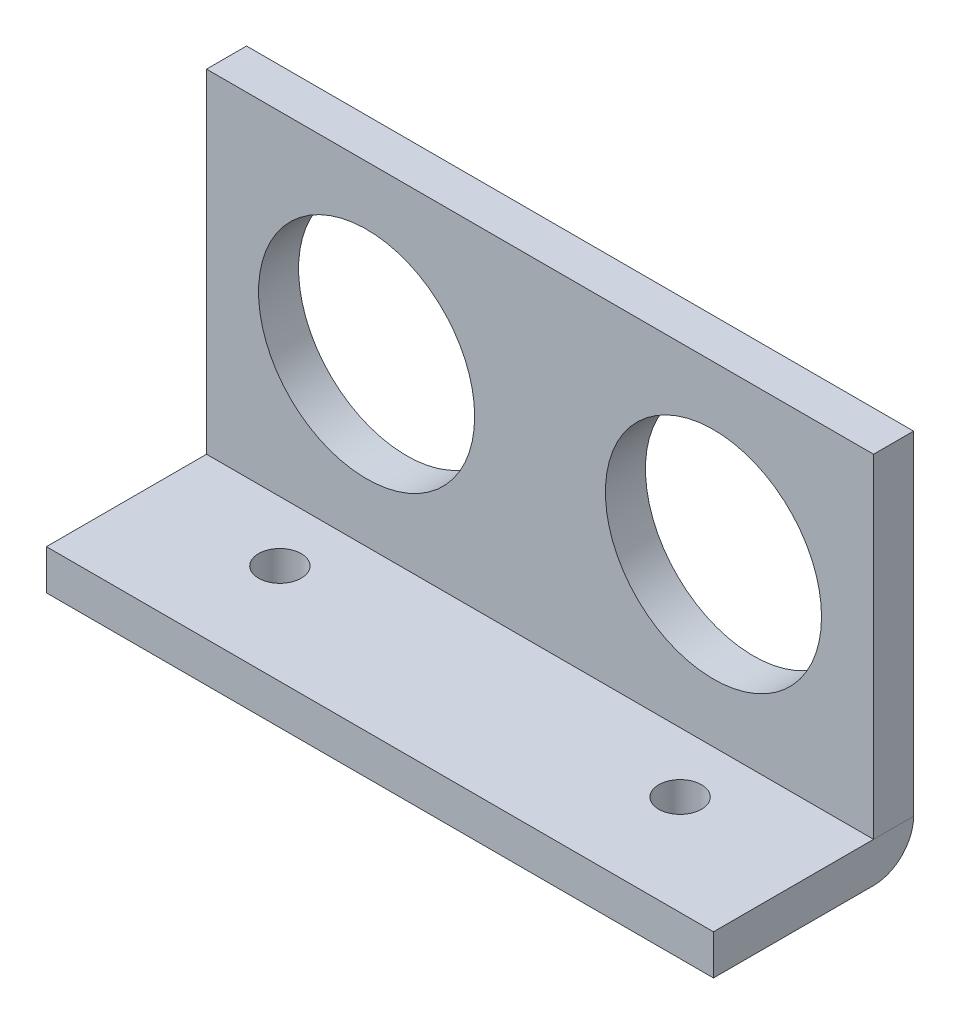
ISO-10303-21;
HEADER;
FILE_DESCRIPTION(('STEP AP214'),'2;1');
FILE_NAME('part.step','',(''),(''),'','','');
FILE_SCHEMA(('AUTOMOTIVE_DESIGN { 1 0 10303 214 1 1 1 1 }'));
ENDSEC;
DATA;
#1=APPLICATION_CONTEXT('core data for automotive mechanical design processes');
#2=APPLICATION_PROTOCOL_DEFINITION('international standard','automotive_design',2000,#1);
#3=PRODUCT_CONTEXT('',#1,'mechanical');
#4=PRODUCT('Part','Part','',(#3));
#5=PRODUCT_RELATED_PRODUCT_CATEGORY('part','',(#4));
#6=PRODUCT_DEFINITION_FORMATION('','',#4);
#7=PRODUCT_DEFINITION_CONTEXT('part definition',#1,'design');
#8=PRODUCT_DEFINITION('design','',#6,#7);
#9=PRODUCT_DEFINITION_SHAPE('','',#8);
#10=(LENGTH_UNIT() NAMED_UNIT(*) SI_UNIT(.MILLI.,.METRE.));
#11=(NAMED_UNIT(*) PLANE_ANGLE_UNIT() SI_UNIT($,.RADIAN.));
#12=(NAMED_UNIT(*) SI_UNIT($,.STERADIAN.) SOLID_ANGLE_UNIT());
#13=UNCERTAINTY_MEASURE_WITH_UNIT(LENGTH_MEASURE(1.E-05),#10,'distance_accuracy_value','');
#14=(GEOMETRIC_REPRESENTATION_CONTEXT(3) GLOBAL_UNCERTAINTY_ASSIGNED_CONTEXT((#13)) GLOBAL_UNIT_ASSIGNED_CONTEXT((#10,
#11,#12)) REPRESENTATION_CONTEXT('',''));
#15=CARTESIAN_POINT('',(0.,0.,0.));
#16=DIRECTION('',(0.,0.,1.));
#17=DIRECTION('',(1.,0.,0.));
#18=AXIS2_PLACEMENT_3D('',#15,#16,#17);
#19=CARTESIAN_POINT('',(-25.,28.,-4.5));
#20=DIRECTION('',(1.,0.,0.));
#21=DIRECTION('',(0.,0.,-1.));
#22=AXIS2_PLACEMENT_3D('',#19,#20,#21);
#23=PLANE('',#22);
#24=DIRECTION('',(0.,0.,1.));
#25=VECTOR('',#24,1.);
#26=CARTESIAN_POINT('',(-25.,3.,-4.5));
#27=LINE('',#26,#25);
#28=CARTESIAN_POINT('',(-25.,3.,-7.5));
#29=VERTEX_POINT('',#28);
#30=CARTESIAN_POINT('',(-25.,3.,-4.5));
#31=VERTEX_POINT('',#30);
#32=EDGE_CURVE('E116',#29,#31,#27,.T.);
#33=ORIENTED_EDGE('',*,*,#32,.T.);
#34=DIRECTION('',(0.,-1.,0.));
#35=VECTOR('',#34,1.);
#36=CARTESIAN_POINT('',(-25.,28.,-4.5));
#37=LINE('',#36,#35);
#38=CARTESIAN_POINT('',(-25.,28.,-4.5));
#39=VERTEX_POINT('',#38);
#40=EDGE_CURVE('E12',#39,#31,#37,.T.);
#41=ORIENTED_EDGE('',*,*,#40,.F.);
#42=DIRECTION('',(0.,0.,1.));
#43=VECTOR('',#42,1.);
#44=CARTESIAN_POINT('',(-25.,28.,-4.5));
#45=LINE('',#44,#43);
#46=CARTESIAN_POINT('',(-25.,28.,-7.5));
#47=VERTEX_POINT('',#46);
#48=EDGE_CURVE('E104',#47,#39,#45,.T.);
#49=ORIENTED_EDGE('',*,*,#48,.F.);
#50=DIRECTION('',(0.,-1.,0.));
#51=VECTOR('',#50,1.);
#52=CARTESIAN_POINT('',(-25.,28.,-7.5));
#53=LINE('',#52,#51);
#54=EDGE_CURVE('E112',#47,#29,#53,.T.);
#55=ORIENTED_EDGE('',*,*,#54,.T.);
#56=EDGE_LOOP('',(#33,#41,#49,#55));
#57=FACE_BOUND('',#56,.T.);
#58=ADVANCED_FACE('F53',(#57),#23,.F.);
#59=CARTESIAN_POINT('',(-25.,28.,-4.5));
#60=DIRECTION('',(0.,0.,-1.));
#61=DIRECTION('',(-1.,0.,0.));
#62=AXIS2_PLACEMENT_3D('',#59,#60,#61);
#63=PLANE('',#62);
#64=CARTESIAN_POINT('',(-13.,15.500000000003,-4.5));
#65=DIRECTION('',(0.,0.,1.));
#66=DIRECTION('',(1.,0.,0.));
#67=AXIS2_PLACEMENT_3D('',#64,#65,#66);
#68=CIRCLE('',#67,8.1);
#69=CARTESIAN_POINT('',(-4.9,15.500000000003,-4.5));
#70=VERTEX_POINT('',#69);
#71=EDGE_CURVE('E136',#70,#70,#68,.T.);
#72=ORIENTED_EDGE('',*,*,#71,.F.);
#73=EDGE_LOOP('',(#72));
#74=FACE_BOUND('',#73,.T.);
#75=CARTESIAN_POINT('',(13.,15.500000000003,-4.5));
#76=DIRECTION('',(0.,0.,1.));
#77=DIRECTION('',(1.,0.,0.));
#78=AXIS2_PLACEMENT_3D('',#75,#76,#77);
#79=CIRCLE('',#78,8.1);
#80=CARTESIAN_POINT('',(21.1,15.500000000003,-4.5));
#81=VERTEX_POINT('',#80);
#82=EDGE_CURVE('E133',#81,#81,#79,.T.);
#83=ORIENTED_EDGE('',*,*,#82,.F.);
#84=EDGE_LOOP('',(#83));
#85=FACE_BOUND('',#84,.T.);
#86=DIRECTION('',(1.,0.,0.));
#87=VECTOR('',#86,1.);
#88=CARTESIAN_POINT('',(-25.,3.,-4.5));
#89=LINE('',#88,#87);
#90=CARTESIAN_POINT('',(25.,3.,-4.5));
#91=VERTEX_POINT('',#90);
#92=EDGE_CURVE('E108',#31,#91,#89,.T.);
#93=ORIENTED_EDGE('',*,*,#92,.T.);
#94=DIRECTION('',(0.,-1.,0.));
#95=VECTOR('',#94,1.);
#96=CARTESIAN_POINT('',(25.,28.,-4.5));
#97=LINE('',#96,#95);
#98=CARTESIAN_POINT('',(25.,28.,-4.5));
#99=VERTEX_POINT('',#98);
#100=EDGE_CURVE('E61',#99,#91,#97,.T.);
#101=ORIENTED_EDGE('',*,*,#100,.F.);
#102=DIRECTION('',(1.,0.,0.));
#103=VECTOR('',#102,1.);
#104=CARTESIAN_POINT('',(-25.,28.,-4.5));
#105=LINE('',#104,#103);
#106=EDGE_CURVE('E99',#39,#99,#105,.T.);
#107=ORIENTED_EDGE('',*,*,#106,.F.);
#108=ORIENTED_EDGE('',*,*,#40,.T.);
#109=EDGE_LOOP('',(#93,#101,#107,#108));
#110=FACE_BOUND('',#109,.T.);
#111=ADVANCED_FACE('F107',(#74,#85,#110),#63,.F.);
#112=CARTESIAN_POINT('',(25.,28.,-4.5));
#113=DIRECTION('',(-1.,0.,0.));
#114=DIRECTION('',(0.,0.,1.));
#115=AXIS2_PLACEMENT_3D('',#112,#113,#114);
#116=PLANE('',#115);
#117=DIRECTION('',(0.,0.,-1.));
#118=VECTOR('',#117,1.);
#119=CARTESIAN_POINT('',(25.,3.,-4.5));
#120=LINE('',#119,#118);
#121=CARTESIAN_POINT('',(25.,3.,-7.5));
#122=VERTEX_POINT('',#121);
#123=EDGE_CURVE('E86',#91,#122,#120,.T.);
#124=ORIENTED_EDGE('',*,*,#123,.T.);
#125=DIRECTION('',(0.,-1.,0.));
#126=VECTOR('',#125,1.);
#127=CARTESIAN_POINT('',(25.,28.,-7.5));
#128=LINE('',#127,#126);
#129=CARTESIAN_POINT('',(25.,28.,-7.5));
#130=VERTEX_POINT('',#129);
#131=EDGE_CURVE('E109',#130,#122,#128,.T.);
#132=ORIENTED_EDGE('',*,*,#131,.F.);
#133=DIRECTION('',(0.,0.,-1.));
#134=VECTOR('',#133,1.);
#135=CARTESIAN_POINT('',(25.,28.,-4.5));
#136=LINE('',#135,#134);
#137=EDGE_CURVE('E102',#99,#130,#136,.T.);
#138=ORIENTED_EDGE('',*,*,#137,.F.);
#139=ORIENTED_EDGE('',*,*,#100,.T.);
#140=EDGE_LOOP('',(#124,#132,#138,#139));
#141=FACE_BOUND('',#140,.T.);
#142=ADVANCED_FACE('F110',(#141),#116,.F.);
#143=CARTESIAN_POINT('',(-25.,28.,-7.5));
#144=DIRECTION('',(0.,0.,1.));
#145=DIRECTION('',(1.,0.,0.));
#146=AXIS2_PLACEMENT_3D('',#143,#144,#145);
#147=PLANE('',#146);
#148=CARTESIAN_POINT('',(-13.,15.500000000003,-7.5));
#149=DIRECTION('',(0.,0.,1.));
#150=DIRECTION('',(1.,0.,0.));
#151=AXIS2_PLACEMENT_3D('',#148,#149,#150);
#152=CIRCLE('',#151,8.1);
#153=CARTESIAN_POINT('',(-4.9,15.500000000003,-7.5));
#154=VERTEX_POINT('',#153);
#155=EDGE_CURVE('E119',#154,#154,#152,.T.);
#156=ORIENTED_EDGE('',*,*,#155,.T.);
#157=EDGE_LOOP('',(#156));
#158=FACE_BOUND('',#157,.T.);
#159=CARTESIAN_POINT('',(13.,15.500000000003,-7.5));
#160=DIRECTION('',(0.,0.,1.));
#161=DIRECTION('',(1.,0.,0.));
#162=AXIS2_PLACEMENT_3D('',#159,#160,#161);
#163=CIRCLE('',#162,8.1);
#164=CARTESIAN_POINT('',(21.1,15.500000000003,-7.5));
#165=VERTEX_POINT('',#164);
#166=EDGE_CURVE('E130',#165,#165,#163,.T.);
#167=ORIENTED_EDGE('',*,*,#166,.T.);
#168=EDGE_LOOP('',(#167));
#169=FACE_BOUND('',#168,.T.);
#170=DIRECTION('',(-1.,0.,0.));
#171=VECTOR('',#170,1.);
#172=CARTESIAN_POINT('',(-25.,3.,-7.5));
#173=LINE('',#172,#171);
#174=EDGE_CURVE('E92',#122,#29,#173,.T.);
#175=ORIENTED_EDGE('',*,*,#174,.T.);
#176=ORIENTED_EDGE('',*,*,#54,.F.);
#177=DIRECTION('',(-1.,0.,0.));
#178=VECTOR('',#177,1.);
#179=CARTESIAN_POINT('',(-25.,28.,-7.5));
#180=LINE('',#179,#178);
#181=EDGE_CURVE('E69',#130,#47,#180,.T.);
#182=ORIENTED_EDGE('',*,*,#181,.F.);
#183=ORIENTED_EDGE('',*,*,#131,.T.);
#184=EDGE_LOOP('',(#175,#176,#182,#183));
#185=FACE_BOUND('',#184,.T.);
#186=ADVANCED_FACE('F124',(#158,#169,#185),#147,.F.);
#187=CARTESIAN_POINT('',(0.,28.,0.));
#188=DIRECTION('',(0.,-1.,0.));
#189=DIRECTION('',(0.,0.,-1.));
#190=AXIS2_PLACEMENT_3D('',#187,#188,#189);
#191=PLANE('',#190);
#192=ORIENTED_EDGE('',*,*,#48,.T.);
#193=ORIENTED_EDGE('',*,*,#106,.T.);
#194=ORIENTED_EDGE('',*,*,#137,.T.);
#195=ORIENTED_EDGE('',*,*,#181,.T.);
#196=EDGE_LOOP('',(#192,#193,#194,#195));
#197=FACE_BOUND('',#196,.T.);
#198=ADVANCED_FACE('F100',(#197),#191,.F.);
#199=CARTESIAN_POINT('',(0.,3.,0.));
#200=DIRECTION('',(0.,-1.,0.));
#201=DIRECTION('',(0.,0.,-1.));
#202=AXIS2_PLACEMENT_3D('',#199,#200,#201);
#203=PLANE('',#202);
#204=ORIENTED_EDGE('',*,*,#32,.F.);
#205=ORIENTED_EDGE('',*,*,#174,.F.);
#206=ORIENTED_EDGE('',*,*,#123,.F.);
#207=ORIENTED_EDGE('',*,*,#92,.F.);
#208=EDGE_LOOP('',(#204,#205,#206,#207));
#209=FACE_BOUND('',#208,.T.);
#210=ADVANCED_FACE('F127',(#209),#203,.T.);
#211=CARTESIAN_POINT('',(13.,15.500000000003,-7.5));
#212=DIRECTION('',(0.,0.,1.));
#213=DIRECTION('',(1.,0.,0.));
#214=AXIS2_PLACEMENT_3D('',#211,#212,#213);
#215=CYLINDRICAL_SURFACE('',#214,8.1);
#216=ORIENTED_EDGE('',*,*,#166,.F.);
#217=EDGE_LOOP('',(#216));
#218=FACE_BOUND('',#217,.T.);
#219=ORIENTED_EDGE('',*,*,#82,.T.);
#220=EDGE_LOOP('',(#219));
#221=FACE_BOUND('',#220,.T.);
#222=ADVANCED_FACE('F147',(#218,#221),#215,.F.);
#223=CARTESIAN_POINT('',(-13.,15.500000000003,-7.5));
#224=DIRECTION('',(0.,0.,1.));
#225=DIRECTION('',(1.,0.,0.));
#226=AXIS2_PLACEMENT_3D('',#223,#224,#225);
#227=CYLINDRICAL_SURFACE('',#226,8.1);
#228=ORIENTED_EDGE('',*,*,#155,.F.);
#229=EDGE_LOOP('',(#228));
#230=FACE_BOUND('',#229,.T.);
#231=ORIENTED_EDGE('',*,*,#71,.T.);
#232=EDGE_LOOP('',(#231));
#233=FACE_BOUND('',#232,.T.);
#234=ADVANCED_FACE('F144',(#230,#233),#227,.F.);
#235=CLOSED_SHELL('',(#58,#111,#142,#186,#198,#210,#222,#234));
#236=MANIFOLD_SOLID_BREP('B2',#235);
#237=CARTESIAN_POINT('',(0.,3.,0.));
#238=DIRECTION('',(0.,1.,0.));
#239=DIRECTION('',(0.,0.,1.));
#240=AXIS2_PLACEMENT_3D('',#237,#238,#239);
#241=PLANE('',#240);
#242=CARTESIAN_POINT('',(-15.,3.,0.));
#243=DIRECTION('',(0.,1.,0.));
#244=DIRECTION('',(0.,0.,1.));
#245=AXIS2_PLACEMENT_3D('',#242,#243,#244);
#246=CIRCLE('',#245,1.6);
#247=CARTESIAN_POINT('',(-15.,3.,1.6));
#248=VERTEX_POINT('',#247);
#249=EDGE_CURVE('E284',#248,#248,#246,.T.);
#250=ORIENTED_EDGE('',*,*,#249,.F.);
#251=EDGE_LOOP('',(#250));
#252=FACE_BOUND('',#251,.T.);
#253=DIRECTION('',(0.,0.,-1.));
#254=VECTOR('',#253,1.);
#255=CARTESIAN_POINT('',(25.,3.,-7.5));
#256=LINE('',#255,#254);
#257=CARTESIAN_POINT('',(25.,3.,7.5));
#258=VERTEX_POINT('',#257);
#259=CARTESIAN_POINT('',(25.,3.,-7.5));
#260=VERTEX_POINT('',#259);
#261=EDGE_CURVE('E262',#258,#260,#256,.T.);
#262=ORIENTED_EDGE('',*,*,#261,.T.);
#263=DIRECTION('',(-1.,0.,0.));
#264=VECTOR('',#263,1.);
#265=CARTESIAN_POINT('',(-25.,3.,-7.5));
#266=LINE('',#265,#264);
#267=CARTESIAN_POINT('',(-25.,3.,-7.5));
#268=VERTEX_POINT('',#267);
#269=EDGE_CURVE('E269',#260,#268,#266,.T.);
#270=ORIENTED_EDGE('',*,*,#269,.T.);
#271=DIRECTION('',(0.,0.,1.));
#272=VECTOR('',#271,1.);
#273=CARTESIAN_POINT('',(-25.,3.,-7.5));
#274=LINE('',#273,#272);
#275=CARTESIAN_POINT('',(-25.,3.,7.5));
#276=VERTEX_POINT('',#275);
#277=EDGE_CURVE('E275',#268,#276,#274,.T.);
#278=ORIENTED_EDGE('',*,*,#277,.T.);
#279=DIRECTION('',(1.,0.,0.));
#280=VECTOR('',#279,1.);
#281=CARTESIAN_POINT('',(-25.,3.,7.5));
#282=LINE('',#281,#280);
#283=EDGE_CURVE('E271',#276,#258,#282,.T.);
#284=ORIENTED_EDGE('',*,*,#283,.T.);
#285=EDGE_LOOP('',(#262,#270,#278,#284));
#286=FACE_BOUND('',#285,.T.);
#287=CARTESIAN_POINT('',(15.,3.,0.));
#288=DIRECTION('',(0.,1.,0.));
#289=DIRECTION('',(0.,0.,1.));
#290=AXIS2_PLACEMENT_3D('',#287,#288,#289);
#291=CIRCLE('',#290,1.6);
#292=CARTESIAN_POINT('',(15.,3.,1.6));
#293=VERTEX_POINT('',#292);
#294=EDGE_CURVE('E327',#293,#293,#291,.T.);
#295=ORIENTED_EDGE('',*,*,#294,.F.);
#296=EDGE_LOOP('',(#295));
#297=FACE_BOUND('',#296,.T.);
#298=ADVANCED_FACE('F219',(#252,#286,#297),#241,.T.);
#299=CARTESIAN_POINT('',(0.,0.,0.));
#300=DIRECTION('',(0.,1.,0.));
#301=DIRECTION('',(0.,0.,1.));
#302=AXIS2_PLACEMENT_3D('',#299,#300,#301);
#303=PLANE('',#302);
#304=DIRECTION('',(0.,0.,1.));
#305=VECTOR('',#304,1.);
#306=CARTESIAN_POINT('',(-25.,0.,-7.5));
#307=LINE('',#306,#305);
#308=CARTESIAN_POINT('',(-25.,0.,-4.5));
#309=VERTEX_POINT('',#308);
#310=CARTESIAN_POINT('',(-25.,0.,7.5));
#311=VERTEX_POINT('',#310);
#312=EDGE_CURVE('E283',#309,#311,#307,.T.);
#313=ORIENTED_EDGE('',*,*,#312,.F.);
#314=DIRECTION('',(-1.,0.,0.));
#315=VECTOR('',#314,1.);
#316=CARTESIAN_POINT('',(0.,0.,-4.5));
#317=LINE('',#316,#315);
#318=CARTESIAN_POINT('',(25.,0.,-4.5));
#319=VERTEX_POINT('',#318);
#320=EDGE_CURVE('E227',#309,#319,#317,.F.);
#321=ORIENTED_EDGE('',*,*,#320,.T.);
#322=DIRECTION('',(0.,0.,-1.));
#323=VECTOR('',#322,1.);
#324=CARTESIAN_POINT('',(25.,0.,-7.5));
#325=LINE('',#324,#323);
#326=CARTESIAN_POINT('',(25.,0.,7.5));
#327=VERTEX_POINT('',#326);
#328=EDGE_CURVE('E263',#327,#319,#325,.T.);
#329=ORIENTED_EDGE('',*,*,#328,.F.);
#330=DIRECTION('',(1.,0.,0.));
#331=VECTOR('',#330,1.);
#332=CARTESIAN_POINT('',(-25.,0.,7.5));
#333=LINE('',#332,#331);
#334=EDGE_CURVE('E273',#311,#327,#333,.T.);
#335=ORIENTED_EDGE('',*,*,#334,.F.);
#336=EDGE_LOOP('',(#313,#321,#329,#335));
#337=FACE_BOUND('',#336,.T.);
#338=CARTESIAN_POINT('',(-15.,0.,0.));
#339=DIRECTION('',(0.,1.,0.));
#340=DIRECTION('',(0.,0.,1.));
#341=AXIS2_PLACEMENT_3D('',#338,#339,#340);
#342=CIRCLE('',#341,1.6);
#343=CARTESIAN_POINT('',(-15.,0.,1.6));
#344=VERTEX_POINT('',#343);
#345=EDGE_CURVE('E333',#344,#344,#342,.T.);
#346=ORIENTED_EDGE('',*,*,#345,.T.);
#347=EDGE_LOOP('',(#346));
#348=FACE_BOUND('',#347,.T.);
#349=CARTESIAN_POINT('',(15.,0.,0.));
#350=DIRECTION('',(0.,1.,0.));
#351=DIRECTION('',(0.,0.,1.));
#352=AXIS2_PLACEMENT_3D('',#349,#350,#351);
#353=CIRCLE('',#352,1.6);
#354=CARTESIAN_POINT('',(15.,0.,1.6));
#355=VERTEX_POINT('',#354);
#356=EDGE_CURVE('E330',#355,#355,#353,.T.);
#357=ORIENTED_EDGE('',*,*,#356,.T.);
#358=EDGE_LOOP('',(#357));
#359=FACE_BOUND('',#358,.T.);
#360=ADVANCED_FACE('F295',(#337,#348,#359),#303,.F.);
#361=CARTESIAN_POINT('',(25.,3.,-7.5));
#362=DIRECTION('',(-1.,0.,0.));
#363=DIRECTION('',(0.,0.,1.));
#364=AXIS2_PLACEMENT_3D('',#361,#362,#363);
#365=PLANE('',#364);
#366=ORIENTED_EDGE('',*,*,#328,.T.);
#367=CARTESIAN_POINT('',(25.,3.,-4.5));
#368=DIRECTION('',(-1.,0.,0.));
#369=DIRECTION('',(0.,0.,1.));
#370=AXIS2_PLACEMENT_3D('',#367,#368,#369);
#371=CIRCLE('',#370,3.);
#372=EDGE_CURVE('E51',#319,#260,#371,.F.);
#373=ORIENTED_EDGE('',*,*,#372,.T.);
#374=ORIENTED_EDGE('',*,*,#261,.F.);
#375=DIRECTION('',(0.,-1.,0.));
#376=VECTOR('',#375,1.);
#377=CARTESIAN_POINT('',(25.,3.,7.5));
#378=LINE('',#377,#376);
#379=EDGE_CURVE('E281',#258,#327,#378,.T.);
#380=ORIENTED_EDGE('',*,*,#379,.T.);
#381=EDGE_LOOP('',(#366,#373,#374,#380));
#382=FACE_BOUND('',#381,.T.);
#383=ADVANCED_FACE('F260',(#382),#365,.F.);
#384=CARTESIAN_POINT('',(-25.,3.,-7.5));
#385=DIRECTION('',(1.,0.,0.));
#386=DIRECTION('',(0.,0.,-1.));
#387=AXIS2_PLACEMENT_3D('',#384,#385,#386);
#388=PLANE('',#387);
#389=ORIENTED_EDGE('',*,*,#277,.F.);
#390=CARTESIAN_POINT('',(-25.,3.,-4.5));
#391=DIRECTION('',(1.,0.,0.));
#392=DIRECTION('',(0.,0.,-1.));
#393=AXIS2_PLACEMENT_3D('',#390,#391,#392);
#394=CIRCLE('',#393,3.);
#395=EDGE_CURVE('E241',#268,#309,#394,.F.);
#396=ORIENTED_EDGE('',*,*,#395,.T.);
#397=ORIENTED_EDGE('',*,*,#312,.T.);
#398=DIRECTION('',(0.,-1.,0.));
#399=VECTOR('',#398,1.);
#400=CARTESIAN_POINT('',(-25.,3.,7.5));
#401=LINE('',#400,#399);
#402=EDGE_CURVE('E288',#276,#311,#401,.T.);
#403=ORIENTED_EDGE('',*,*,#402,.F.);
#404=EDGE_LOOP('',(#389,#396,#397,#403));
#405=FACE_BOUND('',#404,.T.);
#406=ADVANCED_FACE('F297',(#405),#388,.F.);
#407=CARTESIAN_POINT('',(-25.,3.,7.5));
#408=DIRECTION('',(0.,0.,-1.));
#409=DIRECTION('',(-1.,0.,0.));
#410=AXIS2_PLACEMENT_3D('',#407,#408,#409);
#411=PLANE('',#410);
#412=ORIENTED_EDGE('',*,*,#334,.T.);
#413=ORIENTED_EDGE('',*,*,#379,.F.);
#414=ORIENTED_EDGE('',*,*,#283,.F.);
#415=ORIENTED_EDGE('',*,*,#402,.T.);
#416=EDGE_LOOP('',(#412,#413,#414,#415));
#417=FACE_BOUND('',#416,.T.);
#418=ADVANCED_FACE('F294',(#417),#411,.F.);
#419=CARTESIAN_POINT('',(-15.,3.,0.));
#420=DIRECTION('',(0.,-1.,0.));
#421=DIRECTION('',(0.,0.,-1.));
#422=AXIS2_PLACEMENT_3D('',#419,#420,#421);
#423=CYLINDRICAL_SURFACE('',#422,1.6);
#424=ORIENTED_EDGE('',*,*,#249,.T.);
#425=EDGE_LOOP('',(#424));
#426=FACE_BOUND('',#425,.T.);
#427=ORIENTED_EDGE('',*,*,#345,.F.);
#428=EDGE_LOOP('',(#427));
#429=FACE_BOUND('',#428,.T.);
#430=ADVANCED_FACE('F305',(#426,#429),#423,.F.);
#431=CARTESIAN_POINT('',(15.,3.,0.));
#432=DIRECTION('',(0.,-1.,0.));
#433=DIRECTION('',(0.,0.,-1.));
#434=AXIS2_PLACEMENT_3D('',#431,#432,#433);
#435=CYLINDRICAL_SURFACE('',#434,1.6);
#436=ORIENTED_EDGE('',*,*,#294,.T.);
#437=EDGE_LOOP('',(#436));
#438=FACE_BOUND('',#437,.T.);
#439=ORIENTED_EDGE('',*,*,#356,.F.);
#440=EDGE_LOOP('',(#439));
#441=FACE_BOUND('',#440,.T.);
#442=ADVANCED_FACE('F319',(#438,#441),#435,.F.);
#443=CARTESIAN_POINT('',(-25.,3.,-4.5));
#444=DIRECTION('',(-1.,0.,0.));
#445=DIRECTION('',(0.,0.,1.));
#446=AXIS2_PLACEMENT_3D('',#443,#444,#445);
#447=CYLINDRICAL_SURFACE('',#446,3.);
#448=ORIENTED_EDGE('',*,*,#372,.F.);
#449=ORIENTED_EDGE('',*,*,#320,.F.);
#450=ORIENTED_EDGE('',*,*,#395,.F.);
#451=ORIENTED_EDGE('',*,*,#269,.F.);
#452=EDGE_LOOP('',(#448,#449,#450,#451));
#453=FACE_BOUND('',#452,.T.);
#454=ADVANCED_FACE('F221',(#453),#447,.T.);
#455=CLOSED_SHELL('',(#298,#360,#383,#406,#418,#430,#442,#454));
#456=MANIFOLD_SOLID_BREP('B6',#455);
#457=ADVANCED_BREP_SHAPE_REPRESENTATION('',(#18,#236,#456),#14);
#458=SHAPE_DEFINITION_REPRESENTATION(#9,#457);
ENDSEC;
END-ISO-10303-21;
